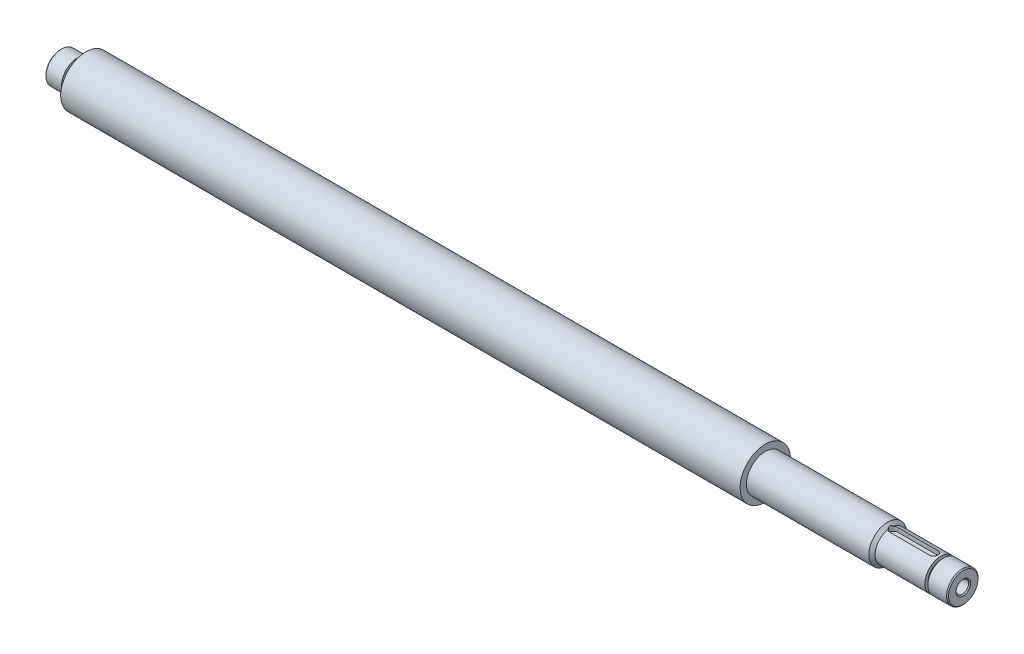
ISO-10303-21;
HEADER;
FILE_DESCRIPTION(('STEP AP214'),'2;1');
FILE_NAME('part.step','',(''),(''),'','','');
FILE_SCHEMA(('AUTOMOTIVE_DESIGN { 1 0 10303 214 1 1 1 1 }'));
ENDSEC;
DATA;
#1=APPLICATION_CONTEXT('core data for automotive mechanical design processes');
#2=APPLICATION_PROTOCOL_DEFINITION('international standard','automotive_design',2000,#1);
#3=PRODUCT_CONTEXT('',#1,'mechanical');
#4=PRODUCT('Part','Part','',(#3));
#5=PRODUCT_RELATED_PRODUCT_CATEGORY('part','',(#4));
#6=PRODUCT_DEFINITION_FORMATION('','',#4);
#7=PRODUCT_DEFINITION_CONTEXT('part definition',#1,'design');
#8=PRODUCT_DEFINITION('design','',#6,#7);
#9=PRODUCT_DEFINITION_SHAPE('','',#8);
#10=(LENGTH_UNIT() NAMED_UNIT(*) SI_UNIT(.MILLI.,.METRE.));
#11=(NAMED_UNIT(*) PLANE_ANGLE_UNIT() SI_UNIT($,.RADIAN.));
#12=(NAMED_UNIT(*) SI_UNIT($,.STERADIAN.) SOLID_ANGLE_UNIT());
#13=UNCERTAINTY_MEASURE_WITH_UNIT(LENGTH_MEASURE(1.E-05),#10,'distance_accuracy_value','');
#14=(GEOMETRIC_REPRESENTATION_CONTEXT(3) GLOBAL_UNCERTAINTY_ASSIGNED_CONTEXT((#13)) GLOBAL_UNIT_ASSIGNED_CONTEXT((#10,
#11,#12)) REPRESENTATION_CONTEXT('',''));
#15=CARTESIAN_POINT('',(0.,0.,0.));
#16=DIRECTION('',(0.,0.,1.));
#17=DIRECTION('',(1.,0.,0.));
#18=AXIS2_PLACEMENT_3D('',#15,#16,#17);
#19=CARTESIAN_POINT('',(211.89314999998,0.,0.));
#20=DIRECTION('',(1.,0.,0.));
#21=DIRECTION('',(0.,0.,-1.));
#22=AXIS2_PLACEMENT_3D('',#19,#20,#21);
#23=PLANE('',#22);
#24=CARTESIAN_POINT('',(211.89314999998,0.,0.));
#25=DIRECTION('',(1.,0.,0.));
#26=DIRECTION('',(0.,0.,-1.));
#27=AXIS2_PLACEMENT_3D('',#24,#25,#26);
#28=CIRCLE('',#27,1.5875);
#29=CARTESIAN_POINT('',(211.89314999998,0.,-1.5875));
#30=VERTEX_POINT('',#29);
#31=EDGE_CURVE('E19',#30,#30,#28,.T.);
#32=ORIENTED_EDGE('',*,*,#31,.T.);
#33=EDGE_LOOP('',(#32));
#34=FACE_BOUND('',#33,.T.);
#35=ADVANCED_FACE('F16',(#34),#23,.T.);
#36=CARTESIAN_POINT('',(211.89314999998,0.,0.));
#37=DIRECTION('',(1.,0.,0.));
#38=DIRECTION('',(0.,0.,-1.));
#39=AXIS2_PLACEMENT_3D('',#36,#37,#38);
#40=CYLINDRICAL_SURFACE('',#39,1.5875);
#41=ORIENTED_EDGE('',*,*,#31,.F.);
#42=EDGE_LOOP('',(#41));
#43=FACE_BOUND('',#42,.T.);
#44=CARTESIAN_POINT('',(230.689149999989,0.,0.));
#45=DIRECTION('',(1.,0.,0.));
#46=DIRECTION('',(0.,0.,-1.));
#47=AXIS2_PLACEMENT_3D('',#44,#45,#46);
#48=CIRCLE('',#47,1.58750000002783);
#49=CARTESIAN_POINT('',(230.689149999989,0.,-1.58750000002783));
#50=VERTEX_POINT('',#49);
#51=EDGE_CURVE('E108',#50,#50,#48,.T.);
#52=ORIENTED_EDGE('',*,*,#51,.T.);
#53=EDGE_LOOP('',(#52));
#54=FACE_BOUND('',#53,.T.);
#55=ADVANCED_FACE('F196',(#43,#54),#40,.F.);
#56=CARTESIAN_POINT('',(230.94314999986,0.,0.));
#57=DIRECTION('',(1.,0.,0.));
#58=DIRECTION('',(0.,1.,0.));
#59=AXIS2_PLACEMENT_3D('',#56,#57,#58);
#60=CONICAL_SURFACE('',#59,1.84149999995498,0.785398163397448);
#61=ORIENTED_EDGE('',*,*,#51,.F.);
#62=EDGE_LOOP('',(#61));
#63=FACE_BOUND('',#62,.T.);
#64=CARTESIAN_POINT('',(230.943149999973,0.,0.));
#65=DIRECTION('',(1.,0.,0.));
#66=DIRECTION('',(0.,1.,0.));
#67=AXIS2_PLACEMENT_3D('',#64,#65,#66);
#68=CIRCLE('',#67,1.84150000006866);
#69=CARTESIAN_POINT('',(230.943149999973,1.84150000006866,0.));
#70=VERTEX_POINT('',#69);
#71=EDGE_CURVE('E110',#70,#70,#68,.F.);
#72=ORIENTED_EDGE('',*,*,#71,.F.);
#73=EDGE_LOOP('',(#72));
#74=FACE_BOUND('',#73,.T.);
#75=ADVANCED_FACE('F193',(#63,#74),#60,.F.);
#76=CARTESIAN_POINT('',(230.94314999998,0.,0.));
#77=DIRECTION('',(1.,0.,0.));
#78=DIRECTION('',(0.,0.,-1.));
#79=AXIS2_PLACEMENT_3D('',#76,#77,#78);
#80=PLANE('',#79);
#81=CARTESIAN_POINT('',(230.94315000003,0.,0.));
#82=DIRECTION('',(-1.,0.,0.));
#83=DIRECTION('',(0.,0.,1.));
#84=AXIS2_PLACEMENT_3D('',#81,#82,#83);
#85=CIRCLE('',#84,3.7147499999719);
#86=CARTESIAN_POINT('',(230.94315000003,0.,3.7147499999719));
#87=VERTEX_POINT('',#86);
#88=EDGE_CURVE('E107',#87,#87,#85,.T.);
#89=ORIENTED_EDGE('',*,*,#88,.F.);
#90=EDGE_LOOP('',(#89));
#91=FACE_BOUND('',#90,.T.);
#92=ORIENTED_EDGE('',*,*,#71,.T.);
#93=EDGE_LOOP('',(#92));
#94=FACE_BOUND('',#93,.T.);
#95=ADVANCED_FACE('F189',(#91,#94),#80,.T.);
#96=CARTESIAN_POINT('',(230.689149999932,0.,0.));
#97=DIRECTION('',(-1.,0.,0.));
#98=DIRECTION('',(0.,0.,1.));
#99=AXIS2_PLACEMENT_3D('',#96,#97,#98);
#100=CONICAL_SURFACE('',#99,3.96875000001273,0.785398163285552);
#101=ORIENTED_EDGE('',*,*,#88,.T.);
#102=EDGE_LOOP('',(#101));
#103=FACE_BOUND('',#102,.T.);
#104=CARTESIAN_POINT('',(230.68914999998,0.,0.));
#105=DIRECTION('',(-1.,0.,0.));
#106=DIRECTION('',(0.,0.,1.));
#107=AXIS2_PLACEMENT_3D('',#104,#105,#106);
#108=CIRCLE('',#107,3.96875);
#109=CARTESIAN_POINT('',(230.68914999998,0.,3.96875));
#110=VERTEX_POINT('',#109);
#111=EDGE_CURVE('E103',#110,#110,#108,.T.);
#112=ORIENTED_EDGE('',*,*,#111,.F.);
#113=EDGE_LOOP('',(#112));
#114=FACE_BOUND('',#113,.T.);
#115=ADVANCED_FACE('F185',(#103,#114),#100,.T.);
#116=CARTESIAN_POINT('',(3.175,0.,0.));
#117=DIRECTION('',(-1.,0.,0.));
#118=DIRECTION('',(0.,0.,1.));
#119=AXIS2_PLACEMENT_3D('',#116,#117,#118);
#120=PLANE('',#119);
#121=CARTESIAN_POINT('',(3.17499999999882,0.,0.));
#122=DIRECTION('',(1.,0.,0.));
#123=DIRECTION('',(0.,0.,-1.));
#124=AXIS2_PLACEMENT_3D('',#121,#122,#123);
#125=CIRCLE('',#124,3.71475000002874);
#126=CARTESIAN_POINT('',(3.17499999999882,0.,-3.71475000002874));
#127=VERTEX_POINT('',#126);
#128=EDGE_CURVE('E106',#127,#127,#125,.T.);
#129=ORIENTED_EDGE('',*,*,#128,.F.);
#130=EDGE_LOOP('',(#129));
#131=FACE_BOUND('',#130,.T.);
#132=ADVANCED_FACE('F181',(#131),#120,.T.);
#133=CARTESIAN_POINT('',(230.94314999998,0.,0.));
#134=DIRECTION('',(-1.,0.,0.));
#135=DIRECTION('',(0.,0.,1.));
#136=AXIS2_PLACEMENT_3D('',#133,#134,#135);
#137=CYLINDRICAL_SURFACE('',#136,3.96875);
#138=ORIENTED_EDGE('',*,*,#111,.T.);
#139=EDGE_LOOP('',(#138));
#140=FACE_BOUND('',#139,.T.);
#141=CARTESIAN_POINT('',(225.96474999998,0.,0.));
#142=DIRECTION('',(-1.,0.,0.));
#143=DIRECTION('',(0.,0.,1.));
#144=AXIS2_PLACEMENT_3D('',#141,#142,#143);
#145=CIRCLE('',#144,3.96875);
#146=CARTESIAN_POINT('',(225.96474999998,0.,3.96875));
#147=VERTEX_POINT('',#146);
#148=EDGE_CURVE('E77',#147,#147,#145,.T.);
#149=ORIENTED_EDGE('',*,*,#148,.F.);
#150=EDGE_LOOP('',(#149));
#151=FACE_BOUND('',#150,.T.);
#152=ADVANCED_FACE('F177',(#140,#151),#137,.T.);
#153=CARTESIAN_POINT('',(3.42899999992596,0.,0.));
#154=DIRECTION('',(1.,0.,0.));
#155=DIRECTION('',(0.,0.,-1.));
#156=AXIS2_PLACEMENT_3D('',#153,#154,#155);
#157=CONICAL_SURFACE('',#156,3.96874999995589,0.785398163397448);
#158=ORIENTED_EDGE('',*,*,#128,.T.);
#159=EDGE_LOOP('',(#158));
#160=FACE_BOUND('',#159,.T.);
#161=CARTESIAN_POINT('',(3.42900000000003,0.,0.));
#162=DIRECTION('',(1.,0.,0.));
#163=DIRECTION('',(0.,0.,-1.));
#164=AXIS2_PLACEMENT_3D('',#161,#162,#163);
#165=CIRCLE('',#164,3.96875);
#166=CARTESIAN_POINT('',(3.42900000000003,0.,-3.96875));
#167=VERTEX_POINT('',#166);
#168=EDGE_CURVE('E99',#167,#167,#165,.T.);
#169=ORIENTED_EDGE('',*,*,#168,.F.);
#170=EDGE_LOOP('',(#169));
#171=FACE_BOUND('',#170,.T.);
#172=ADVANCED_FACE('F173',(#160,#171),#157,.T.);
#173=CARTESIAN_POINT('',(225.96474999998,0.,-22.225));
#174=DIRECTION('',(-1.,0.,0.));
#175=DIRECTION('',(0.,0.,1.));
#176=AXIS2_PLACEMENT_3D('',#173,#174,#175);
#177=PLANE('',#176);
#178=ORIENTED_EDGE('',*,*,#148,.T.);
#179=EDGE_LOOP('',(#178));
#180=FACE_BOUND('',#179,.T.);
#181=CARTESIAN_POINT('',(225.96474999998,0.,0.));
#182=DIRECTION('',(1.,0.,0.));
#183=DIRECTION('',(0.,0.,-1.));
#184=AXIS2_PLACEMENT_3D('',#181,#182,#183);
#185=CIRCLE('',#184,3.175);
#186=CARTESIAN_POINT('',(225.96474999998,0.,-3.175));
#187=VERTEX_POINT('',#186);
#188=EDGE_CURVE('E102',#187,#187,#185,.F.);
#189=ORIENTED_EDGE('',*,*,#188,.F.);
#190=EDGE_LOOP('',(#189));
#191=FACE_BOUND('',#190,.T.);
#192=ADVANCED_FACE('F167',(#180,#191),#177,.T.);
#193=CARTESIAN_POINT('',(213.41714999998,5.30554999999999,0.));
#194=DIRECTION('',(0.,-1.,0.));
#195=DIRECTION('',(0.,0.,-1.));
#196=AXIS2_PLACEMENT_3D('',#193,#194,#195);
#197=CYLINDRICAL_SURFACE('',#196,1.016);
#198=CARTESIAN_POINT('',(213.41714999998,3.83649847680146,1.01600000000003));
#199=CARTESIAN_POINT('',(213.389074339526,3.83649655807795,1.0160002409862));
#200=CARTESIAN_POINT('',(213.3610128192,3.83680706636788,1.01483546195628));
#201=CARTESIAN_POINT('',(213.305099410303,3.83803295663375,1.01019216098554));
#202=CARTESIAN_POINT('',(213.277247490381,3.83894824625515,1.00671399231572));
#203=CARTESIAN_POINT('',(213.194402662799,3.84256546981599,0.992856299490572));
#204=CARTESIAN_POINT('',(213.139979413233,3.84613895420595,0.979053401170284));
#205=CARTESIAN_POINT('',(213.034316289364,3.85519131533632,0.942773419508405));
#206=CARTESIAN_POINT('',(212.983076692287,3.86067035773495,0.920295581999016));
#207=CARTESIAN_POINT('',(212.885096296162,3.87291119616643,0.867334861884752));
#208=CARTESIAN_POINT('',(212.838352927547,3.87967225289173,0.836856589068626));
#209=CARTESIAN_POINT('',(212.769226267174,3.89074557233876,0.783245948925208));
#210=CARTESIAN_POINT('',(212.744929693409,3.8948780584502,0.762492759902288));
#211=CARTESIAN_POINT('',(212.698437109469,3.90317153116697,0.718833958467463));
#212=CARTESIAN_POINT('',(212.676237660528,3.90733245868102,0.695931996925387));
#213=CARTESIAN_POINT('',(212.655149999973,3.9114402158937,0.672020833002573));
#214=B_SPLINE_CURVE_WITH_KNOTS('',3,(#198,#199,#200,#201,#202,#203,#204,#205,#206,#207,#208,
#209,#210,#211,#212,#213),.UNSPECIFIED.,.F.,.F.,(4,2,2,2,2,2,2,4),(0.,0.0841733007172617,
0.168333750525264,0.336236358766308,0.504153567141386,0.671974234494312,0.768506844658152,
0.864878312961598),.UNSPECIFIED.);
#215=CARTESIAN_POINT('',(213.41714999998,3.83649847680146,1.01600000000003));
#216=VERTEX_POINT('',#215);
#217=CARTESIAN_POINT('',(212.655149999952,3.91144021584657,0.672020832978743));
#218=VERTEX_POINT('',#217);
#219=EDGE_CURVE('E95',#216,#218,#214,.T.);
#220=ORIENTED_EDGE('',*,*,#219,.F.);
#221=DIRECTION('',(0.,-1.,0.));
#222=VECTOR('',#221,1.);
#223=CARTESIAN_POINT('',(213.41714999998,5.30554999999999,1.01600000000003));
#224=LINE('',#223,#222);
#225=CARTESIAN_POINT('',(213.41714999998,2.81634999999999,1.01600000000003));
#226=VERTEX_POINT('',#225);
#227=EDGE_CURVE('E93',#226,#216,#224,.F.);
#228=ORIENTED_EDGE('',*,*,#227,.F.);
#229=CARTESIAN_POINT('',(213.41714999998,2.81634999999999,0.));
#230=DIRECTION('',(0.,-1.,0.));
#231=DIRECTION('',(0.,0.,-1.));
#232=AXIS2_PLACEMENT_3D('',#229,#230,#231);
#233=CIRCLE('',#232,1.016);
#234=CARTESIAN_POINT('',(213.41714999998,2.81634999999999,-1.01599999999997));
#235=VERTEX_POINT('',#234);
#236=EDGE_CURVE('E91',#226,#235,#233,.T.);
#237=ORIENTED_EDGE('',*,*,#236,.T.);
#238=DIRECTION('',(0.,-1.,0.));
#239=VECTOR('',#238,1.);
#240=CARTESIAN_POINT('',(213.41714999998,5.30554999999999,-1.01599999999997));
#241=LINE('',#240,#239);
#242=CARTESIAN_POINT('',(213.41714999998,3.83649847680148,-1.01599999999997));
#243=VERTEX_POINT('',#242);
#244=EDGE_CURVE('E76',#243,#235,#241,.T.);
#245=ORIENTED_EDGE('',*,*,#244,.F.);
#246=CARTESIAN_POINT('',(212.655149999992,3.91144021587443,-0.672020832992129));
#247=CARTESIAN_POINT('',(212.692863201921,3.90408226838363,-0.714842817983423));
#248=CARTESIAN_POINT('',(212.734224918746,3.89655779756395,-0.754419427854209));
#249=CARTESIAN_POINT('',(212.823086497349,3.88197562196556,-0.826189348854525));
#250=CARTESIAN_POINT('',(212.870594355152,3.87491854366382,-0.858372887616274));
#251=CARTESIAN_POINT('',(212.970547344967,3.8620864095337,-0.914382203672152));
#252=CARTESIAN_POINT('',(213.022998681664,3.85631299621705,-0.938197295478196));
#253=CARTESIAN_POINT('',(213.131257868987,3.84676049934421,-0.976630360324479));
#254=CARTESIAN_POINT('',(213.187058548844,3.84297731334582,-0.991267264359491));
#255=CARTESIAN_POINT('',(213.272317957099,3.83912394272337,-1.00604532812568));
#256=CARTESIAN_POINT('',(213.301156173611,3.83814278398683,-1.00977546870113));
#257=CARTESIAN_POINT('',(213.359041321679,3.83682913357452,-1.01475220932438));
#258=CARTESIAN_POINT('',(213.388088101489,3.83649621045303,-1.01600046125277));
#259=CARTESIAN_POINT('',(213.41714999998,3.83649847680148,-1.01599999999997));
#260=B_SPLINE_CURVE_WITH_KNOTS('',3,(#246,#247,#248,#249,#250,#251,#252,#253,#254,#255,#256,
#257,#258,#259),.UNSPECIFIED.,.F.,.F.,(4,2,2,2,2,2,4),(0.,0.172404553979964,0.345035702355903,
0.517886485479154,0.690379562389539,0.777564930764994,0.864692251373678),.UNSPECIFIED.);
#261=CARTESIAN_POINT('',(212.655149999947,3.91144021580976,-0.67202083297334));
#262=VERTEX_POINT('',#261);
#263=EDGE_CURVE('E66',#262,#243,#260,.T.);
#264=ORIENTED_EDGE('',*,*,#263,.F.);
#265=CARTESIAN_POINT('',(212.655149999963,3.9114402158369,0.67202083297575));
#266=CARTESIAN_POINT('',(212.626045649258,3.94663707761286,0.638985000103938));
#267=CARTESIAN_POINT('',(212.598134454973,3.9805736242155,0.603031915385518));
#268=CARTESIAN_POINT('',(212.545782346293,4.04446808091199,0.524633539282124));
#269=CARTESIAN_POINT('',(212.521387328845,4.07437308915874,0.48211520021806));
#270=CARTESIAN_POINT('',(212.483246421746,4.12126181445549,0.401911695226639));
#271=CARTESIAN_POINT('',(212.468355806803,4.13961619959977,0.36559456637402));
#272=CARTESIAN_POINT('',(212.442514459882,4.17151821853133,0.289723753071765));
#273=CARTESIAN_POINT('',(212.431548734038,4.18508414239573,0.250183109991939));
#274=CARTESIAN_POINT('',(212.414258213124,4.20649305468733,0.168050687437434));
#275=CARTESIAN_POINT('',(212.407988168619,4.21426852203809,0.125429079948235));
#276=CARTESIAN_POINT('',(212.400977206253,4.22296361726393,0.0390204895675334));
#277=CARTESIAN_POINT('',(212.400234806667,4.22388508240417,-0.00476617786256917));
#278=CARTESIAN_POINT('',(212.404035806214,4.21917025657142,-0.0849404597716708));
#279=CARTESIAN_POINT('',(212.407784476603,4.21451992543416,-0.121431098091056));
#280=CARTESIAN_POINT('',(212.418977695528,4.20064865427047,-0.192918818071544));
#281=CARTESIAN_POINT('',(212.426421938457,4.19142809218092,-0.227916022972787));
#282=CARTESIAN_POINT('',(212.447034893173,4.16593408538058,-0.305201192207211));
#283=CARTESIAN_POINT('',(212.461220946358,4.14841101060279,-0.346801535780249));
#284=CARTESIAN_POINT('',(212.493725643355,4.10836577717508,-0.425891694231429));
#285=CARTESIAN_POINT('',(212.512060244429,4.08582432100951,-0.463364783623912));
#286=CARTESIAN_POINT('',(212.550316407117,4.03894291032933,-0.531281217455228));
#287=CARTESIAN_POINT('',(212.57001172543,4.01486952296427,-0.562042296558948));
#288=CARTESIAN_POINT('',(212.611284433429,3.96459674585499,-0.619737119732681));
#289=CARTESIAN_POINT('',(212.632841403126,3.93842059932922,-0.646705536943316));
#290=CARTESIAN_POINT('',(212.655149999962,3.91144021582057,-0.672020832990241));
#291=B_SPLINE_CURVE_WITH_KNOTS('',3,(#265,#266,#267,#268,#269,#270,#271,#272,#273,#274,#275,
#276,#277,#278,#279,#280,#281,#282,#283,#284,#285,#286,#287,#288,#289,#290),.UNSPECIFIED.,.F.,
.F.,(4,2,2,2,2,2,2,2,2,2,2,2,4),(0.,0.16949129143385,0.341026069711211,0.470534814543615,
0.599543392165577,0.730033713399552,0.860489054492614,0.970897544460874,1.08129690568263,
1.22247535006713,1.36420635365072,1.495174434255,1.62485417006379),.UNSPECIFIED.);
#292=EDGE_CURVE('E60',#218,#262,#291,.T.);
#293=ORIENTED_EDGE('',*,*,#292,.F.);
#294=EDGE_LOOP('',(#220,#228,#237,#245,#264,#293));
#295=FACE_BOUND('',#294,.T.);
#296=ADVANCED_FACE('F89',(#295),#197,.F.);
#297=CARTESIAN_POINT('',(3.175,0.,0.));
#298=DIRECTION('',(1.,0.,0.));
#299=DIRECTION('',(0.,0.,-1.));
#300=AXIS2_PLACEMENT_3D('',#297,#298,#299);
#301=CYLINDRICAL_SURFACE('',#300,3.96875);
#302=ORIENTED_EDGE('',*,*,#168,.T.);
#303=EDGE_LOOP('',(#302));
#304=FACE_BOUND('',#303,.T.);
#305=CARTESIAN_POINT('',(7.39140000000003,0.,0.));
#306=DIRECTION('',(1.,0.,0.));
#307=DIRECTION('',(0.,0.,-1.));
#308=AXIS2_PLACEMENT_3D('',#305,#306,#307);
#309=CIRCLE('',#308,3.96875);
#310=CARTESIAN_POINT('',(7.39140000000003,0.,-3.96875));
#311=VERTEX_POINT('',#310);
#312=EDGE_CURVE('E259',#311,#311,#309,.T.);
#313=ORIENTED_EDGE('',*,*,#312,.F.);
#314=EDGE_LOOP('',(#313));
#315=FACE_BOUND('',#314,.T.);
#316=ADVANCED_FACE('F166',(#304,#315),#301,.T.);
#317=CARTESIAN_POINT('',(211.8614,0.,0.));
#318=DIRECTION('',(1.,0.,0.));
#319=DIRECTION('',(0.,0.,-1.));
#320=AXIS2_PLACEMENT_3D('',#317,#318,#319);
#321=CYLINDRICAL_SURFACE('',#320,3.175);
#322=CARTESIAN_POINT('',(225.22814999998,0.,0.));
#323=DIRECTION('',(1.,0.,0.));
#324=DIRECTION('',(0.,0.,-1.));
#325=AXIS2_PLACEMENT_3D('',#322,#323,#324);
#326=CIRCLE('',#325,3.175);
#327=CARTESIAN_POINT('',(225.22814999998,0.,-3.175));
#328=VERTEX_POINT('',#327);
#329=EDGE_CURVE('E255',#328,#328,#326,.F.);
#330=ORIENTED_EDGE('',*,*,#329,.F.);
#331=EDGE_LOOP('',(#330));
#332=FACE_BOUND('',#331,.T.);
#333=ORIENTED_EDGE('',*,*,#188,.T.);
#334=EDGE_LOOP('',(#333));
#335=FACE_BOUND('',#334,.T.);
#336=ADVANCED_FACE('F269',(#332,#335),#321,.T.);
#337=CARTESIAN_POINT('',(213.41714999998,2.81634999999999,0.));
#338=DIRECTION('',(0.,-1.,0.));
#339=DIRECTION('',(0.,0.,-1.));
#340=AXIS2_PLACEMENT_3D('',#337,#338,#339);
#341=PLANE('',#340);
#342=DIRECTION('',(1.,0.,0.));
#343=VECTOR('',#342,1.);
#344=CARTESIAN_POINT('',(213.41714999998,2.81634999999999,1.01600000000003));
#345=LINE('',#344,#343);
#346=CARTESIAN_POINT('',(223.57714999998,2.81634999999999,1.01600000000003));
#347=VERTEX_POINT('',#346);
#348=EDGE_CURVE('E251',#226,#347,#345,.T.);
#349=ORIENTED_EDGE('',*,*,#348,.T.);
#350=CARTESIAN_POINT('',(223.57714999998,2.81634999999999,0.));
#351=DIRECTION('',(0.,-1.,0.));
#352=DIRECTION('',(0.,0.,-1.));
#353=AXIS2_PLACEMENT_3D('',#350,#351,#352);
#354=CIRCLE('',#353,1.016);
#355=CARTESIAN_POINT('',(223.57714999998,2.81634999999999,-1.01599999999997));
#356=VERTEX_POINT('',#355);
#357=EDGE_CURVE('E253',#347,#356,#354,.F.);
#358=ORIENTED_EDGE('',*,*,#357,.T.);
#359=DIRECTION('',(-1.,0.,0.));
#360=VECTOR('',#359,1.);
#361=CARTESIAN_POINT('',(213.41714999998,2.81634999999999,-1.01599999999997));
#362=LINE('',#361,#360);
#363=EDGE_CURVE('E254',#356,#235,#362,.T.);
#364=ORIENTED_EDGE('',*,*,#363,.T.);
#365=ORIENTED_EDGE('',*,*,#236,.F.);
#366=EDGE_LOOP('',(#349,#358,#364,#365));
#367=FACE_BOUND('',#366,.T.);
#368=ADVANCED_FACE('F272',(#367),#341,.F.);
#369=CARTESIAN_POINT('',(7.39140000000003,0.,-22.225));
#370=DIRECTION('',(1.,0.,0.));
#371=DIRECTION('',(0.,0.,-1.));
#372=AXIS2_PLACEMENT_3D('',#369,#370,#371);
#373=PLANE('',#372);
#374=ORIENTED_EDGE('',*,*,#312,.T.);
#375=EDGE_LOOP('',(#374));
#376=FACE_BOUND('',#375,.T.);
#377=CARTESIAN_POINT('',(7.39140000000002,0.,0.));
#378=DIRECTION('',(1.,0.,0.));
#379=DIRECTION('',(0.,0.,-1.));
#380=AXIS2_PLACEMENT_3D('',#377,#378,#379);
#381=CIRCLE('',#380,3.17500000000005);
#382=CARTESIAN_POINT('',(7.39140000000002,0.,-3.17500000000005));
#383=VERTEX_POINT('',#382);
#384=EDGE_CURVE('E250',#383,#383,#381,.T.);
#385=ORIENTED_EDGE('',*,*,#384,.F.);
#386=EDGE_LOOP('',(#385));
#387=FACE_BOUND('',#386,.T.);
#388=ADVANCED_FACE('F278',(#376,#387),#373,.T.);
#389=CARTESIAN_POINT('',(225.22814999998,0.,-22.225));
#390=DIRECTION('',(1.,0.,0.));
#391=DIRECTION('',(0.,0.,-1.));
#392=AXIS2_PLACEMENT_3D('',#389,#390,#391);
#393=PLANE('',#392);
#394=CARTESIAN_POINT('',(225.22814999998,0.,0.));
#395=DIRECTION('',(-1.,0.,0.));
#396=DIRECTION('',(0.,0.,1.));
#397=AXIS2_PLACEMENT_3D('',#394,#395,#396);
#398=CIRCLE('',#397,3.96875);
#399=CARTESIAN_POINT('',(225.22814999998,0.,3.96875));
#400=VERTEX_POINT('',#399);
#401=EDGE_CURVE('E86',#400,#400,#398,.T.);
#402=ORIENTED_EDGE('',*,*,#401,.F.);
#403=EDGE_LOOP('',(#402));
#404=FACE_BOUND('',#403,.T.);
#405=ORIENTED_EDGE('',*,*,#329,.T.);
#406=EDGE_LOOP('',(#405));
#407=FACE_BOUND('',#406,.T.);
#408=ADVANCED_FACE('F284',(#404,#407),#393,.T.);
#409=CARTESIAN_POINT('',(213.41714999998,5.30554999999999,-1.01599999999997));
#410=DIRECTION('',(0.,0.,-1.));
#411=DIRECTION('',(-1.,0.,0.));
#412=AXIS2_PLACEMENT_3D('',#409,#410,#411);
#413=PLANE('',#412);
#414=ORIENTED_EDGE('',*,*,#363,.F.);
#415=DIRECTION('',(0.,-1.,0.));
#416=VECTOR('',#415,1.);
#417=CARTESIAN_POINT('',(223.57714999998,5.30554999999999,-1.01599999999997));
#418=LINE('',#417,#416);
#419=CARTESIAN_POINT('',(223.57714999998,3.83649847680148,-1.01599999999997));
#420=VERTEX_POINT('',#419);
#421=EDGE_CURVE('E84',#356,#420,#418,.F.);
#422=ORIENTED_EDGE('',*,*,#421,.T.);
#423=DIRECTION('',(-1.,0.,0.));
#424=VECTOR('',#423,1.);
#425=CARTESIAN_POINT('',(230.94314999998,3.83649847680148,-1.01599999999998));
#426=LINE('',#425,#424);
#427=EDGE_CURVE('E72',#243,#420,#426,.F.);
#428=ORIENTED_EDGE('',*,*,#427,.F.);
#429=ORIENTED_EDGE('',*,*,#244,.T.);
#430=EDGE_LOOP('',(#414,#422,#428,#429));
#431=FACE_BOUND('',#430,.T.);
#432=ADVANCED_FACE('F81',(#431),#413,.F.);
#433=CARTESIAN_POINT('',(223.57714999998,5.30554999999999,0.));
#434=DIRECTION('',(0.,-1.,0.));
#435=DIRECTION('',(0.,0.,-1.));
#436=AXIS2_PLACEMENT_3D('',#433,#434,#435);
#437=CYLINDRICAL_SURFACE('',#436,1.016);
#438=ORIENTED_EDGE('',*,*,#357,.F.);
#439=DIRECTION('',(0.,1.,0.));
#440=VECTOR('',#439,1.);
#441=CARTESIAN_POINT('',(223.57714999998,5.30554999999999,1.01600000000003));
#442=LINE('',#441,#440);
#443=CARTESIAN_POINT('',(223.57714999998,3.83649847680146,1.01600000000003));
#444=VERTEX_POINT('',#443);
#445=EDGE_CURVE('E34',#347,#444,#442,.T.);
#446=ORIENTED_EDGE('',*,*,#445,.T.);
#447=CARTESIAN_POINT('',(223.57714999998,3.83649847680148,-1.01599999999997));
#448=CARTESIAN_POINT('',(223.605232117698,3.8364965307861,-1.01600036882975));
#449=CARTESIAN_POINT('',(223.63330029599,3.83680719885179,-1.0148349780035));
#450=CARTESIAN_POINT('',(223.689226268173,3.83803367436216,-1.01018942257077));
#451=CARTESIAN_POINT('',(223.717084097897,3.83894937627158,-1.00670966165613));
#452=CARTESIAN_POINT('',(223.799921518973,3.8425670200339,-0.992850358077402));
#453=CARTESIAN_POINT('',(223.854331119969,3.84613973249548,-0.979050564349111));
#454=CARTESIAN_POINT('',(223.959962146837,3.85518959202629,-0.942780043809713));
#455=CARTESIAN_POINT('',(224.011183960423,3.86066650696062,-0.920310373877323));
#456=CARTESIAN_POINT('',(224.109157970993,3.87290441870489,-0.867366047154554));
#457=CARTESIAN_POINT('',(224.155908865854,3.87966578790086,-0.836889067919591));
#458=CARTESIAN_POINT('',(224.244660726039,3.89388354188958,-0.768052502794627));
#459=CARTESIAN_POINT('',(224.286543604242,3.90135139962634,-0.729543072267713));
#460=CARTESIAN_POINT('',(224.363335608172,3.91604199140291,-0.646053823404762));
#461=CARTESIAN_POINT('',(224.398243613297,3.92326468589965,-0.60107296734544));
#462=CARTESIAN_POINT('',(224.460580248618,3.93677879775893,-0.505102006545026));
#463=CARTESIAN_POINT('',(224.48789163842,3.94305499816506,-0.45403342340069));
#464=CARTESIAN_POINT('',(224.533495722822,3.95383663506577,-0.347844862832084));
#465=CARTESIAN_POINT('',(224.551790252562,3.95834243184069,-0.292725712418489));
#466=CARTESIAN_POINT('',(224.578461233202,3.96499439613665,-0.181237611453905));
#467=CARTESIAN_POINT('',(224.587039572088,3.9671885264225,-0.124919869410266));
#468=CARTESIAN_POINT('',(224.594668963786,3.96913729991417,-0.0116034940671243));
#469=CARTESIAN_POINT('',(224.59372128116,3.96889226691424,0.0453950478541691));
#470=CARTESIAN_POINT('',(224.582469291487,3.96602573182547,0.15705051895292));
#471=CARTESIAN_POINT('',(224.572383179651,3.96345965101829,0.211731074694014));
#472=CARTESIAN_POINT('',(224.543492100012,3.95630422351476,0.318595637923121));
#473=CARTESIAN_POINT('',(224.5246867361,3.95171478489952,0.37077953187118));
#474=CARTESIAN_POINT('',(224.478717503722,3.94094438262644,0.471739184881178));
#475=CARTESIAN_POINT('',(224.451476902399,3.93474889714661,0.520478392673297));
#476=CARTESIAN_POINT('',(224.389469375869,3.92143706805956,0.61276841725647));
#477=CARTESIAN_POINT('',(224.354701251652,3.91432057782424,0.656318405775418));
#478=CARTESIAN_POINT('',(224.277464717508,3.89970329674694,0.738292158129697));
#479=CARTESIAN_POINT('',(224.234806538737,3.89219732876389,0.776536373111752));
#480=CARTESIAN_POINT('',(224.143591617661,3.87782831789177,0.845378453000202));
#481=CARTESIAN_POINT('',(224.095033261568,3.87096545181421,0.875974218910344));
#482=CARTESIAN_POINT('',(223.993023080127,3.8586388773889,0.928775964053244));
#483=CARTESIAN_POINT('',(223.939544393242,3.8531835536007,0.950932025157893));
#484=CARTESIAN_POINT('',(223.829478708631,3.84439831971568,0.985853852591683));
#485=CARTESIAN_POINT('',(223.77289650192,3.84106522846847,0.998633677961681));
#486=CARTESIAN_POINT('',(223.692708062574,3.83816902624918,1.00967440468688));
#487=CARTESIAN_POINT('',(223.669645740232,3.8375435800947,1.01204684611684));
#488=CARTESIAN_POINT('',(223.623442626753,3.83670846641588,1.01520789726257));
#489=CARTESIAN_POINT('',(223.600302021728,3.83649813111499,1.01599905077559));
#490=CARTESIAN_POINT('',(223.57714999998,3.83649847680146,1.01600000000003));
#491=B_SPLINE_CURVE_WITH_KNOTS('',3,(#447,#448,#449,#450,#451,#452,#453,#454,#455,#456,#457,
#458,#459,#460,#461,#462,#463,#464,#465,#466,#467,#468,#469,#470,#471,#472,#473,#474,#475,#476,
#477,#478,#479,#480,#481,#482,#483,#484,#485,#486,#487,#488,#489,#490),.UNSPECIFIED.,.F.,.F.,(4,
2,2,2,2,2,2,2,2,2,2,2,2,2,2,2,2,2,2,2,2,4),(0.,0.0841930560916533,0.168371430374712,
0.33623645964817,0.50408103223341,0.671974340399662,0.843336289917708,1.01472574881463,
1.18862960092248,1.36249804493098,1.53268338742051,1.70284613843394,1.86905004579872,
2.03526150439921,2.20303170807674,2.37082865446007,2.54336536457757,2.71594937282159,
2.88953887011917,3.06286754658301,3.13239841206054,3.20181733382419),.UNSPECIFIED.);
#492=EDGE_CURVE('E85',#420,#444,#491,.T.);
#493=ORIENTED_EDGE('',*,*,#492,.F.);
#494=ORIENTED_EDGE('',*,*,#421,.F.);
#495=EDGE_LOOP('',(#438,#446,#493,#494));
#496=FACE_BOUND('',#495,.T.);
#497=ADVANCED_FACE('F135',(#496),#437,.F.);
#498=CARTESIAN_POINT('',(213.41714999998,5.30554999999999,1.01600000000003));
#499=DIRECTION('',(0.,0.,1.));
#500=DIRECTION('',(1.,0.,0.));
#501=AXIS2_PLACEMENT_3D('',#498,#499,#500);
#502=PLANE('',#501);
#503=ORIENTED_EDGE('',*,*,#348,.F.);
#504=ORIENTED_EDGE('',*,*,#227,.T.);
#505=DIRECTION('',(-1.,0.,0.));
#506=VECTOR('',#505,1.);
#507=CARTESIAN_POINT('',(230.94314999998,3.83649847680146,1.01600000000002));
#508=LINE('',#507,#506);
#509=EDGE_CURVE('E127',#444,#216,#508,.T.);
#510=ORIENTED_EDGE('',*,*,#509,.F.);
#511=ORIENTED_EDGE('',*,*,#445,.F.);
#512=EDGE_LOOP('',(#503,#504,#510,#511));
#513=FACE_BOUND('',#512,.T.);
#514=ADVANCED_FACE('F292',(#513),#502,.F.);
#515=CARTESIAN_POINT('',(211.8614,0.,0.));
#516=DIRECTION('',(1.,0.,0.));
#517=DIRECTION('',(0.,0.,-1.));
#518=AXIS2_PLACEMENT_3D('',#515,#516,#517);
#519=CYLINDRICAL_SURFACE('',#518,3.17500000000005);
#520=ORIENTED_EDGE('',*,*,#384,.T.);
#521=EDGE_LOOP('',(#520));
#522=FACE_BOUND('',#521,.T.);
#523=CARTESIAN_POINT('',(8.128,0.,0.));
#524=DIRECTION('',(1.,0.,0.));
#525=DIRECTION('',(0.,0.,-1.));
#526=AXIS2_PLACEMENT_3D('',#523,#524,#525);
#527=CIRCLE('',#526,3.17500000000005);
#528=CARTESIAN_POINT('',(8.128,0.,-3.17500000000005));
#529=VERTEX_POINT('',#528);
#530=EDGE_CURVE('E124',#529,#529,#527,.T.);
#531=ORIENTED_EDGE('',*,*,#530,.F.);
#532=EDGE_LOOP('',(#531));
#533=FACE_BOUND('',#532,.T.);
#534=ADVANCED_FACE('F144',(#522,#533),#519,.T.);
#535=CARTESIAN_POINT('',(230.94314999998,0.,0.));
#536=DIRECTION('',(-1.,0.,0.));
#537=DIRECTION('',(0.,0.,1.));
#538=AXIS2_PLACEMENT_3D('',#535,#536,#537);
#539=CYLINDRICAL_SURFACE('',#538,3.96875);
#540=ORIENTED_EDGE('',*,*,#219,.T.);
#541=CARTESIAN_POINT('',(212.655149999932,0.,0.));
#542=DIRECTION('',(-1.,0.,0.));
#543=DIRECTION('',(0.,0.,-1.));
#544=AXIS2_PLACEMENT_3D('',#541,#542,#543);
#545=CIRCLE('',#544,3.96874999989905);
#546=EDGE_CURVE('E73',#262,#218,#545,.T.);
#547=ORIENTED_EDGE('',*,*,#546,.F.);
#548=ORIENTED_EDGE('',*,*,#263,.T.);
#549=ORIENTED_EDGE('',*,*,#427,.T.);
#550=ORIENTED_EDGE('',*,*,#492,.T.);
#551=ORIENTED_EDGE('',*,*,#509,.T.);
#552=EDGE_LOOP('',(#540,#547,#548,#549,#550,#551));
#553=FACE_BOUND('',#552,.T.);
#554=ORIENTED_EDGE('',*,*,#401,.T.);
#555=EDGE_LOOP('',(#554));
#556=FACE_BOUND('',#555,.T.);
#557=ADVANCED_FACE('F69',(#553,#556),#539,.T.);
#558=CARTESIAN_POINT('',(8.128,0.,-22.225));
#559=DIRECTION('',(-1.,0.,0.));
#560=DIRECTION('',(0.,0.,1.));
#561=AXIS2_PLACEMENT_3D('',#558,#559,#560);
#562=PLANE('',#561);
#563=CARTESIAN_POINT('',(8.128,0.,0.));
#564=DIRECTION('',(1.,0.,0.));
#565=DIRECTION('',(0.,0.,-1.));
#566=AXIS2_PLACEMENT_3D('',#563,#564,#565);
#567=CIRCLE('',#566,3.96875);
#568=CARTESIAN_POINT('',(8.128,0.,-3.96875));
#569=VERTEX_POINT('',#568);
#570=EDGE_CURVE('E121',#569,#569,#567,.T.);
#571=ORIENTED_EDGE('',*,*,#570,.F.);
#572=EDGE_LOOP('',(#571));
#573=FACE_BOUND('',#572,.T.);
#574=ORIENTED_EDGE('',*,*,#530,.T.);
#575=EDGE_LOOP('',(#574));
#576=FACE_BOUND('',#575,.T.);
#577=ADVANCED_FACE('F143',(#573,#576),#562,.T.);
#578=CARTESIAN_POINT('',(211.861399999918,0.,0.));
#579=DIRECTION('',(-1.,0.,0.));
#580=DIRECTION('',(0.,0.,1.));
#581=AXIS2_PLACEMENT_3D('',#578,#579,#580);
#582=CONICAL_SURFACE('',#581,4.7624999999698,0.785398163397448);
#583=ORIENTED_EDGE('',*,*,#546,.T.);
#584=ORIENTED_EDGE('',*,*,#292,.T.);
#585=EDGE_LOOP('',(#583,#584));
#586=FACE_BOUND('',#585,.T.);
#587=CARTESIAN_POINT('',(211.8614,0.,0.));
#588=DIRECTION('',(-1.,0.,0.));
#589=DIRECTION('',(0.,0.,1.));
#590=AXIS2_PLACEMENT_3D('',#587,#588,#589);
#591=CIRCLE('',#590,4.7625);
#592=CARTESIAN_POINT('',(211.8614,0.,4.7625));
#593=VERTEX_POINT('',#592);
#594=EDGE_CURVE('E120',#593,#593,#591,.T.);
#595=ORIENTED_EDGE('',*,*,#594,.F.);
#596=EDGE_LOOP('',(#595));
#597=FACE_BOUND('',#596,.T.);
#598=ADVANCED_FACE('F230',(#586,#597),#582,.T.);
#599=CARTESIAN_POINT('',(3.175,0.,0.));
#600=DIRECTION('',(1.,0.,0.));
#601=DIRECTION('',(0.,0.,-1.));
#602=AXIS2_PLACEMENT_3D('',#599,#600,#601);
#603=CYLINDRICAL_SURFACE('',#602,3.96875);
#604=CARTESIAN_POINT('',(9.525,0.,0.));
#605=DIRECTION('',(1.,0.,0.));
#606=DIRECTION('',(0.,0.,-1.));
#607=AXIS2_PLACEMENT_3D('',#604,#605,#606);
#608=CIRCLE('',#607,3.96875);
#609=CARTESIAN_POINT('',(9.525,0.,-3.96875));
#610=VERTEX_POINT('',#609);
#611=EDGE_CURVE('E117',#610,#610,#608,.T.);
#612=ORIENTED_EDGE('',*,*,#611,.F.);
#613=EDGE_LOOP('',(#612));
#614=FACE_BOUND('',#613,.T.);
#615=ORIENTED_EDGE('',*,*,#570,.T.);
#616=EDGE_LOOP('',(#615));
#617=FACE_BOUND('',#616,.T.);
#618=ADVANCED_FACE('F227',(#614,#617),#603,.T.);
#619=CARTESIAN_POINT('',(211.8614,0.,0.));
#620=DIRECTION('',(-1.,0.,0.));
#621=DIRECTION('',(0.,0.,1.));
#622=AXIS2_PLACEMENT_3D('',#619,#620,#621);
#623=CYLINDRICAL_SURFACE('',#622,4.7625);
#624=CARTESIAN_POINT('',(180.975,0.,0.));
#625=DIRECTION('',(-1.,0.,0.));
#626=DIRECTION('',(0.,0.,1.));
#627=AXIS2_PLACEMENT_3D('',#624,#625,#626);
#628=CIRCLE('',#627,4.7625);
#629=CARTESIAN_POINT('',(180.975,0.,4.7625));
#630=VERTEX_POINT('',#629);
#631=EDGE_CURVE('E114',#630,#630,#628,.T.);
#632=ORIENTED_EDGE('',*,*,#631,.F.);
#633=EDGE_LOOP('',(#632));
#634=FACE_BOUND('',#633,.T.);
#635=ORIENTED_EDGE('',*,*,#594,.T.);
#636=EDGE_LOOP('',(#635));
#637=FACE_BOUND('',#636,.T.);
#638=ADVANCED_FACE('F223',(#634,#637),#623,.T.);
#639=CARTESIAN_POINT('',(9.525,6.35000000000002,0.));
#640=DIRECTION('',(-1.,0.,0.));
#641=DIRECTION('',(0.,0.,1.));
#642=AXIS2_PLACEMENT_3D('',#639,#640,#641);
#643=PLANE('',#642);
#644=ORIENTED_EDGE('',*,*,#611,.T.);
#645=EDGE_LOOP('',(#644));
#646=FACE_BOUND('',#645,.T.);
#647=CARTESIAN_POINT('',(9.52500000000001,0.,0.));
#648=DIRECTION('',(1.,0.,0.));
#649=DIRECTION('',(0.,0.,-1.));
#650=AXIS2_PLACEMENT_3D('',#647,#648,#649);
#651=CIRCLE('',#650,6.35000000000004);
#652=CARTESIAN_POINT('',(9.52500000000001,0.,-6.35000000000004));
#653=VERTEX_POINT('',#652);
#654=EDGE_CURVE('E25',#653,#653,#651,.T.);
#655=ORIENTED_EDGE('',*,*,#654,.F.);
#656=EDGE_LOOP('',(#655));
#657=FACE_BOUND('',#656,.T.);
#658=ADVANCED_FACE('F216',(#646,#657),#643,.T.);
#659=CARTESIAN_POINT('',(180.975,0.,0.));
#660=DIRECTION('',(1.,0.,0.));
#661=DIRECTION('',(0.,0.,-1.));
#662=AXIS2_PLACEMENT_3D('',#659,#660,#661);
#663=PLANE('',#662);
#664=ORIENTED_EDGE('',*,*,#631,.T.);
#665=EDGE_LOOP('',(#664));
#666=FACE_BOUND('',#665,.T.);
#667=CARTESIAN_POINT('',(180.975,0.,0.));
#668=DIRECTION('',(1.,0.,0.));
#669=DIRECTION('',(0.,0.,-1.));
#670=AXIS2_PLACEMENT_3D('',#667,#668,#669);
#671=CIRCLE('',#670,6.35000000000004);
#672=CARTESIAN_POINT('',(180.975,0.,-6.35000000000004));
#673=VERTEX_POINT('',#672);
#674=EDGE_CURVE('E11',#673,#673,#671,.F.);
#675=ORIENTED_EDGE('',*,*,#674,.F.);
#676=EDGE_LOOP('',(#675));
#677=FACE_BOUND('',#676,.T.);
#678=ADVANCED_FACE('F210',(#666,#677),#663,.T.);
#679=CARTESIAN_POINT('',(9.525,0.,0.));
#680=DIRECTION('',(1.,0.,0.));
#681=DIRECTION('',(0.,0.,-1.));
#682=AXIS2_PLACEMENT_3D('',#679,#680,#681);
#683=CYLINDRICAL_SURFACE('',#682,6.35000000000004);
#684=ORIENTED_EDGE('',*,*,#654,.T.);
#685=EDGE_LOOP('',(#684));
#686=FACE_BOUND('',#685,.T.);
#687=ORIENTED_EDGE('',*,*,#674,.T.);
#688=EDGE_LOOP('',(#687));
#689=FACE_BOUND('',#688,.T.);
#690=ADVANCED_FACE('F208',(#686,#689),#683,.T.);
#691=CLOSED_SHELL('',(#35,#55,#75,#95,#115,#132,#152,#172,#192,#296,#316,#336,#368,#388,#408,
#432,#497,#514,#534,#557,#577,#598,#618,#638,#658,#678,#690));
#692=MANIFOLD_SOLID_BREP('B1',#691);
#693=ADVANCED_BREP_SHAPE_REPRESENTATION('',(#18,#692),#14);
#694=SHAPE_DEFINITION_REPRESENTATION(#9,#693);
ENDSEC;
END-ISO-10303-21;
